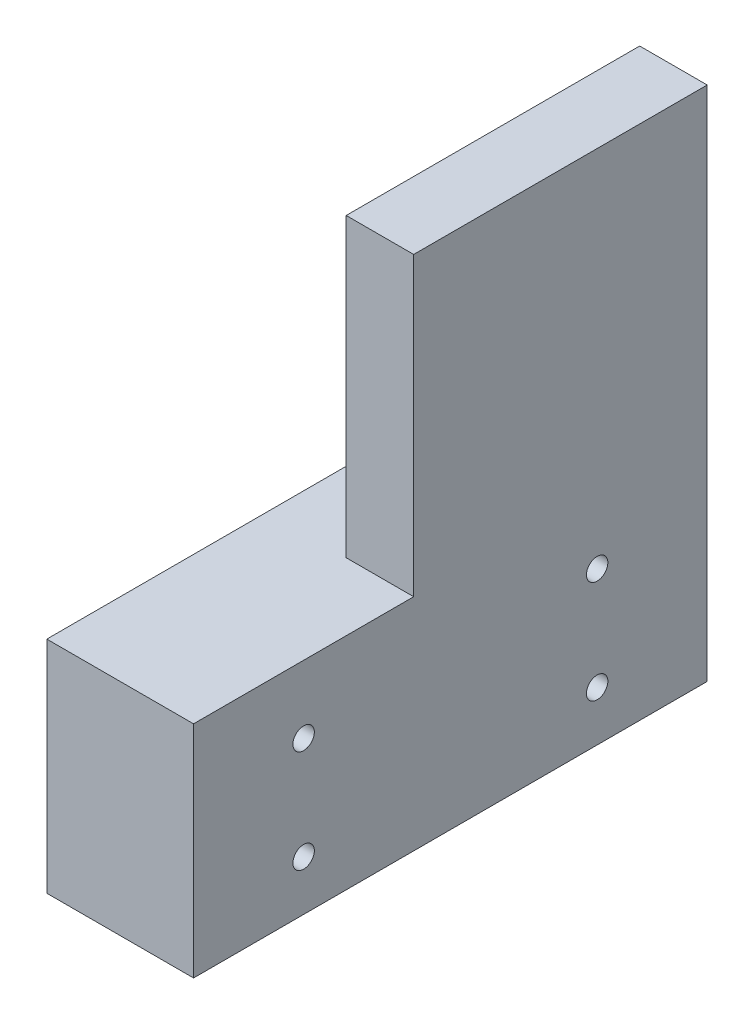
ISO-10303-21;
HEADER;
FILE_DESCRIPTION(('STEP AP214'),'2;1');
FILE_NAME('part.step','',(''),(''),'','','');
FILE_SCHEMA(('AUTOMOTIVE_DESIGN { 1 0 10303 214 1 1 1 1 }'));
ENDSEC;
DATA;
#1=APPLICATION_CONTEXT('core data for automotive mechanical design processes');
#2=APPLICATION_PROTOCOL_DEFINITION('international standard','automotive_design',2000,#1);
#3=PRODUCT_CONTEXT('',#1,'mechanical');
#4=PRODUCT('Part','Part','',(#3));
#5=PRODUCT_RELATED_PRODUCT_CATEGORY('part','',(#4));
#6=PRODUCT_DEFINITION_FORMATION('','',#4);
#7=PRODUCT_DEFINITION_CONTEXT('part definition',#1,'design');
#8=PRODUCT_DEFINITION('design','',#6,#7);
#9=PRODUCT_DEFINITION_SHAPE('','',#8);
#10=(LENGTH_UNIT() NAMED_UNIT(*) SI_UNIT(.MILLI.,.METRE.));
#11=(NAMED_UNIT(*) PLANE_ANGLE_UNIT() SI_UNIT($,.RADIAN.));
#12=(NAMED_UNIT(*) SI_UNIT($,.STERADIAN.) SOLID_ANGLE_UNIT());
#13=UNCERTAINTY_MEASURE_WITH_UNIT(LENGTH_MEASURE(1.E-05),#10,'distance_accuracy_value','');
#14=(GEOMETRIC_REPRESENTATION_CONTEXT(3) GLOBAL_UNCERTAINTY_ASSIGNED_CONTEXT((#13)) GLOBAL_UNIT_ASSIGNED_CONTEXT((#10,
#11,#12)) REPRESENTATION_CONTEXT('',''));
#15=CARTESIAN_POINT('',(0.,0.,0.));
#16=DIRECTION('',(0.,0.,1.));
#17=DIRECTION('',(1.,0.,0.));
#18=AXIS2_PLACEMENT_3D('',#15,#16,#17);
#19=CARTESIAN_POINT('',(12.7,19.05,0.));
#20=DIRECTION('',(0.,-1.,0.));
#21=DIRECTION('',(0.,0.,-1.));
#22=AXIS2_PLACEMENT_3D('',#19,#20,#21);
#23=PLANE('',#22);
#24=DIRECTION('',(1.,0.,0.));
#25=VECTOR('',#24,1.);
#26=CARTESIAN_POINT('',(12.7,19.05,-19.05));
#27=LINE('',#26,#25);
#28=CARTESIAN_POINT('',(6.858,19.05,-19.05));
#29=VERTEX_POINT('',#28);
#30=CARTESIAN_POINT('',(12.7,19.05,-19.05));
#31=VERTEX_POINT('',#30);
#32=EDGE_CURVE('E125',#29,#31,#27,.T.);
#33=ORIENTED_EDGE('',*,*,#32,.F.);
#34=DIRECTION('',(0.,0.,1.));
#35=VECTOR('',#34,1.);
#36=CARTESIAN_POINT('',(6.858,19.05,-44.45));
#37=LINE('',#36,#35);
#38=CARTESIAN_POINT('',(6.858,19.05,-44.45));
#39=VERTEX_POINT('',#38);
#40=EDGE_CURVE('E56',#39,#29,#37,.T.);
#41=ORIENTED_EDGE('',*,*,#40,.F.);
#42=DIRECTION('',(-1.,0.,0.));
#43=VECTOR('',#42,1.);
#44=CARTESIAN_POINT('',(12.7,19.05,-44.45));
#45=LINE('',#44,#43);
#46=CARTESIAN_POINT('',(0.,19.05,-44.45));
#47=VERTEX_POINT('',#46);
#48=EDGE_CURVE('E178',#39,#47,#45,.T.);
#49=ORIENTED_EDGE('',*,*,#48,.T.);
#50=DIRECTION('',(0.,0.,1.));
#51=VECTOR('',#50,1.);
#52=CARTESIAN_POINT('',(0.,19.05,0.));
#53=LINE('',#52,#51);
#54=CARTESIAN_POINT('',(0.,19.05,0.));
#55=VERTEX_POINT('',#54);
#56=EDGE_CURVE('E165',#47,#55,#53,.T.);
#57=ORIENTED_EDGE('',*,*,#56,.T.);
#58=DIRECTION('',(-1.,0.,0.));
#59=VECTOR('',#58,1.);
#60=CARTESIAN_POINT('',(12.7,19.05,0.));
#61=LINE('',#60,#59);
#62=CARTESIAN_POINT('',(12.7,19.05,0.));
#63=VERTEX_POINT('',#62);
#64=EDGE_CURVE('E168',#63,#55,#61,.T.);
#65=ORIENTED_EDGE('',*,*,#64,.F.);
#66=DIRECTION('',(0.,0.,1.));
#67=VECTOR('',#66,1.);
#68=CARTESIAN_POINT('',(12.7,19.05,0.));
#69=LINE('',#68,#67);
#70=EDGE_CURVE('E62',#31,#63,#69,.T.);
#71=ORIENTED_EDGE('',*,*,#70,.F.);
#72=EDGE_LOOP('',(#33,#41,#49,#57,#65,#71));
#73=FACE_BOUND('',#72,.T.);
#74=ADVANCED_FACE('F41',(#73),#23,.F.);
#75=CARTESIAN_POINT('',(12.7,0.,0.));
#76=DIRECTION('',(0.,0.,-1.));
#77=DIRECTION('',(-1.,0.,0.));
#78=AXIS2_PLACEMENT_3D('',#75,#76,#77);
#79=PLANE('',#78);
#80=DIRECTION('',(0.,-1.,0.));
#81=VECTOR('',#80,1.);
#82=CARTESIAN_POINT('',(0.,0.,0.));
#83=LINE('',#82,#81);
#84=CARTESIAN_POINT('',(0.,0.,0.));
#85=VERTEX_POINT('',#84);
#86=EDGE_CURVE('E160',#55,#85,#83,.T.);
#87=ORIENTED_EDGE('',*,*,#86,.T.);
#88=DIRECTION('',(-1.,0.,0.));
#89=VECTOR('',#88,1.);
#90=CARTESIAN_POINT('',(12.7,0.,0.));
#91=LINE('',#90,#89);
#92=CARTESIAN_POINT('',(12.7,0.,0.));
#93=VERTEX_POINT('',#92);
#94=EDGE_CURVE('E11',#93,#85,#91,.T.);
#95=ORIENTED_EDGE('',*,*,#94,.F.);
#96=DIRECTION('',(0.,-1.,0.));
#97=VECTOR('',#96,1.);
#98=CARTESIAN_POINT('',(12.7,0.,0.));
#99=LINE('',#98,#97);
#100=EDGE_CURVE('E163',#63,#93,#99,.T.);
#101=ORIENTED_EDGE('',*,*,#100,.F.);
#102=ORIENTED_EDGE('',*,*,#64,.T.);
#103=EDGE_LOOP('',(#87,#95,#101,#102));
#104=FACE_BOUND('',#103,.T.);
#105=ADVANCED_FACE('F43',(#104),#79,.F.);
#106=CARTESIAN_POINT('',(12.7,0.,0.));
#107=DIRECTION('',(0.,1.,0.));
#108=DIRECTION('',(0.,0.,1.));
#109=AXIS2_PLACEMENT_3D('',#106,#107,#108);
#110=PLANE('',#109);
#111=DIRECTION('',(0.,0.,-1.));
#112=VECTOR('',#111,1.);
#113=CARTESIAN_POINT('',(0.,0.,0.));
#114=LINE('',#113,#112);
#115=CARTESIAN_POINT('',(0.,0.,-44.45));
#116=VERTEX_POINT('',#115);
#117=EDGE_CURVE('E171',#85,#116,#114,.T.);
#118=ORIENTED_EDGE('',*,*,#117,.T.);
#119=DIRECTION('',(-1.,0.,0.));
#120=VECTOR('',#119,1.);
#121=CARTESIAN_POINT('',(12.7,0.,-44.45));
#122=LINE('',#121,#120);
#123=CARTESIAN_POINT('',(12.7,0.,-44.45));
#124=VERTEX_POINT('',#123);
#125=EDGE_CURVE('E49',#124,#116,#122,.T.);
#126=ORIENTED_EDGE('',*,*,#125,.F.);
#127=DIRECTION('',(0.,0.,-1.));
#128=VECTOR('',#127,1.);
#129=CARTESIAN_POINT('',(12.7,0.,0.));
#130=LINE('',#129,#128);
#131=EDGE_CURVE('E106',#93,#124,#130,.T.);
#132=ORIENTED_EDGE('',*,*,#131,.F.);
#133=ORIENTED_EDGE('',*,*,#94,.T.);
#134=EDGE_LOOP('',(#118,#126,#132,#133));
#135=FACE_BOUND('',#134,.T.);
#136=ADVANCED_FACE('F210',(#135),#110,.F.);
#137=CARTESIAN_POINT('',(12.7,0.,-44.45));
#138=DIRECTION('',(0.,0.,1.));
#139=DIRECTION('',(1.,0.,0.));
#140=AXIS2_PLACEMENT_3D('',#137,#138,#139);
#141=PLANE('',#140);
#142=DIRECTION('',(0.,1.,0.));
#143=VECTOR('',#142,1.);
#144=CARTESIAN_POINT('',(0.,0.,-44.45));
#145=LINE('',#144,#143);
#146=EDGE_CURVE('E173',#116,#47,#145,.T.);
#147=ORIENTED_EDGE('',*,*,#146,.T.);
#148=ORIENTED_EDGE('',*,*,#48,.F.);
#149=DIRECTION('',(0.,-1.,0.));
#150=VECTOR('',#149,1.);
#151=CARTESIAN_POINT('',(6.858,44.704,-44.45));
#152=LINE('',#151,#150);
#153=CARTESIAN_POINT('',(6.858,44.704,-44.45));
#154=VERTEX_POINT('',#153);
#155=EDGE_CURVE('E116',#154,#39,#152,.T.);
#156=ORIENTED_EDGE('',*,*,#155,.F.);
#157=DIRECTION('',(-1.,0.,0.));
#158=VECTOR('',#157,1.);
#159=CARTESIAN_POINT('',(12.7,44.704,-44.45));
#160=LINE('',#159,#158);
#161=CARTESIAN_POINT('',(12.7,44.704,-44.45));
#162=VERTEX_POINT('',#161);
#163=EDGE_CURVE('E112',#162,#154,#160,.T.);
#164=ORIENTED_EDGE('',*,*,#163,.F.);
#165=DIRECTION('',(0.,1.,0.));
#166=VECTOR('',#165,1.);
#167=CARTESIAN_POINT('',(12.7,0.,-44.45));
#168=LINE('',#167,#166);
#169=EDGE_CURVE('E99',#124,#162,#168,.T.);
#170=ORIENTED_EDGE('',*,*,#169,.F.);
#171=ORIENTED_EDGE('',*,*,#125,.T.);
#172=EDGE_LOOP('',(#147,#148,#156,#164,#170,#171));
#173=FACE_BOUND('',#172,.T.);
#174=ADVANCED_FACE('F114',(#173),#141,.F.);
#175=CARTESIAN_POINT('',(12.7,0.,0.));
#176=DIRECTION('',(-1.,0.,0.));
#177=DIRECTION('',(0.,0.,1.));
#178=AXIS2_PLACEMENT_3D('',#175,#176,#177);
#179=PLANE('',#178);
#180=CARTESIAN_POINT('',(12.7,13.208,-9.525));
#181=DIRECTION('',(1.,0.,0.));
#182=DIRECTION('',(0.,0.,-1.));
#183=AXIS2_PLACEMENT_3D('',#180,#181,#182);
#184=CIRCLE('',#183,0.927000050999996);
#185=CARTESIAN_POINT('',(12.7,13.208,-10.452000051));
#186=VERTEX_POINT('',#185);
#187=EDGE_CURVE('E138',#186,#186,#184,.T.);
#188=ORIENTED_EDGE('',*,*,#187,.F.);
#189=EDGE_LOOP('',(#188));
#190=FACE_BOUND('',#189,.T.);
#191=CARTESIAN_POINT('',(12.7,13.208,-34.925));
#192=DIRECTION('',(1.,0.,0.));
#193=DIRECTION('',(0.,0.,-1.));
#194=AXIS2_PLACEMENT_3D('',#191,#192,#193);
#195=CIRCLE('',#194,0.927000051000003);
#196=CARTESIAN_POINT('',(12.7,13.208,-35.852000051));
#197=VERTEX_POINT('',#196);
#198=EDGE_CURVE('E149',#197,#197,#195,.T.);
#199=ORIENTED_EDGE('',*,*,#198,.F.);
#200=EDGE_LOOP('',(#199));
#201=FACE_BOUND('',#200,.T.);
#202=CARTESIAN_POINT('',(12.7,4.318,-34.925));
#203=DIRECTION('',(1.,0.,0.));
#204=DIRECTION('',(0.,0.,-1.));
#205=AXIS2_PLACEMENT_3D('',#202,#203,#204);
#206=CIRCLE('',#205,0.927000050999995);
#207=CARTESIAN_POINT('',(12.7,4.318,-35.852000051));
#208=VERTEX_POINT('',#207);
#209=EDGE_CURVE('E143',#208,#208,#206,.T.);
#210=ORIENTED_EDGE('',*,*,#209,.F.);
#211=EDGE_LOOP('',(#210));
#212=FACE_BOUND('',#211,.T.);
#213=CARTESIAN_POINT('',(12.7,4.318,-9.52500000000003));
#214=DIRECTION('',(1.,0.,0.));
#215=DIRECTION('',(0.,0.,-1.));
#216=AXIS2_PLACEMENT_3D('',#213,#214,#215);
#217=CIRCLE('',#216,0.927000050999999);
#218=CARTESIAN_POINT('',(12.7,4.318,-10.452000051));
#219=VERTEX_POINT('',#218);
#220=EDGE_CURVE('E157',#219,#219,#217,.T.);
#221=ORIENTED_EDGE('',*,*,#220,.F.);
#222=EDGE_LOOP('',(#221));
#223=FACE_BOUND('',#222,.T.);
#224=ORIENTED_EDGE('',*,*,#100,.T.);
#225=ORIENTED_EDGE('',*,*,#131,.T.);
#226=ORIENTED_EDGE('',*,*,#169,.T.);
#227=DIRECTION('',(0.,0.,-1.));
#228=VECTOR('',#227,1.);
#229=CARTESIAN_POINT('',(12.7,44.704,-44.45));
#230=LINE('',#229,#228);
#231=CARTESIAN_POINT('',(12.7,44.704,-19.05));
#232=VERTEX_POINT('',#231);
#233=EDGE_CURVE('E105',#232,#162,#230,.T.);
#234=ORIENTED_EDGE('',*,*,#233,.F.);
#235=DIRECTION('',(0.,-1.,0.));
#236=VECTOR('',#235,1.);
#237=CARTESIAN_POINT('',(12.7,44.704,-19.05));
#238=LINE('',#237,#236);
#239=EDGE_CURVE('E131',#232,#31,#238,.T.);
#240=ORIENTED_EDGE('',*,*,#239,.T.);
#241=ORIENTED_EDGE('',*,*,#70,.T.);
#242=EDGE_LOOP('',(#224,#225,#226,#234,#240,#241));
#243=FACE_BOUND('',#242,.T.);
#244=ADVANCED_FACE('F102',(#190,#201,#212,#223,#243),#179,.F.);
#245=CARTESIAN_POINT('',(0.,0.,0.));
#246=DIRECTION('',(-1.,0.,0.));
#247=DIRECTION('',(0.,0.,1.));
#248=AXIS2_PLACEMENT_3D('',#245,#246,#247);
#249=PLANE('',#248);
#250=CARTESIAN_POINT('',(0.,13.208,-9.525));
#251=DIRECTION('',(1.,0.,0.));
#252=DIRECTION('',(0.,0.,-1.));
#253=AXIS2_PLACEMENT_3D('',#250,#251,#252);
#254=CIRCLE('',#253,0.927000050999996);
#255=CARTESIAN_POINT('',(0.,13.208,-10.452000051));
#256=VERTEX_POINT('',#255);
#257=EDGE_CURVE('E152',#256,#256,#254,.T.);
#258=ORIENTED_EDGE('',*,*,#257,.T.);
#259=EDGE_LOOP('',(#258));
#260=FACE_BOUND('',#259,.T.);
#261=CARTESIAN_POINT('',(0.,13.208,-34.925));
#262=DIRECTION('',(1.,0.,0.));
#263=DIRECTION('',(0.,0.,-1.));
#264=AXIS2_PLACEMENT_3D('',#261,#262,#263);
#265=CIRCLE('',#264,0.927000051000003);
#266=CARTESIAN_POINT('',(0.,13.208,-35.852000051));
#267=VERTEX_POINT('',#266);
#268=EDGE_CURVE('E146',#267,#267,#265,.T.);
#269=ORIENTED_EDGE('',*,*,#268,.T.);
#270=EDGE_LOOP('',(#269));
#271=FACE_BOUND('',#270,.T.);
#272=CARTESIAN_POINT('',(0.,4.318,-34.925));
#273=DIRECTION('',(1.,0.,0.));
#274=DIRECTION('',(0.,0.,-1.));
#275=AXIS2_PLACEMENT_3D('',#272,#273,#274);
#276=CIRCLE('',#275,0.927000050999995);
#277=CARTESIAN_POINT('',(0.,4.318,-35.852000051));
#278=VERTEX_POINT('',#277);
#279=EDGE_CURVE('E139',#278,#278,#276,.T.);
#280=ORIENTED_EDGE('',*,*,#279,.T.);
#281=EDGE_LOOP('',(#280));
#282=FACE_BOUND('',#281,.T.);
#283=CARTESIAN_POINT('',(0.,4.318,-9.52500000000003));
#284=DIRECTION('',(1.,0.,0.));
#285=DIRECTION('',(0.,0.,-1.));
#286=AXIS2_PLACEMENT_3D('',#283,#284,#285);
#287=CIRCLE('',#286,0.927000050999999);
#288=CARTESIAN_POINT('',(0.,4.318,-10.452000051));
#289=VERTEX_POINT('',#288);
#290=EDGE_CURVE('E142',#289,#289,#287,.T.);
#291=ORIENTED_EDGE('',*,*,#290,.T.);
#292=EDGE_LOOP('',(#291));
#293=FACE_BOUND('',#292,.T.);
#294=ORIENTED_EDGE('',*,*,#86,.F.);
#295=ORIENTED_EDGE('',*,*,#56,.F.);
#296=ORIENTED_EDGE('',*,*,#146,.F.);
#297=ORIENTED_EDGE('',*,*,#117,.F.);
#298=EDGE_LOOP('',(#294,#295,#296,#297));
#299=FACE_BOUND('',#298,.T.);
#300=ADVANCED_FACE('F184',(#260,#271,#282,#293,#299),#249,.T.);
#301=CARTESIAN_POINT('',(12.7,4.318,-9.52500000000003));
#302=DIRECTION('',(-1.,0.,0.));
#303=DIRECTION('',(0.,0.,1.));
#304=AXIS2_PLACEMENT_3D('',#301,#302,#303);
#305=CYLINDRICAL_SURFACE('',#304,0.927000050999999);
#306=ORIENTED_EDGE('',*,*,#220,.T.);
#307=EDGE_LOOP('',(#306));
#308=FACE_BOUND('',#307,.T.);
#309=ORIENTED_EDGE('',*,*,#290,.F.);
#310=EDGE_LOOP('',(#309));
#311=FACE_BOUND('',#310,.T.);
#312=ADVANCED_FACE('F236',(#308,#311),#305,.F.);
#313=CARTESIAN_POINT('',(12.7,4.318,-34.925));
#314=DIRECTION('',(-1.,0.,0.));
#315=DIRECTION('',(0.,0.,1.));
#316=AXIS2_PLACEMENT_3D('',#313,#314,#315);
#317=CYLINDRICAL_SURFACE('',#316,0.927000050999995);
#318=ORIENTED_EDGE('',*,*,#209,.T.);
#319=EDGE_LOOP('',(#318));
#320=FACE_BOUND('',#319,.T.);
#321=ORIENTED_EDGE('',*,*,#279,.F.);
#322=EDGE_LOOP('',(#321));
#323=FACE_BOUND('',#322,.T.);
#324=ADVANCED_FACE('F243',(#320,#323),#317,.F.);
#325=CARTESIAN_POINT('',(12.7,13.208,-34.925));
#326=DIRECTION('',(-1.,0.,0.));
#327=DIRECTION('',(0.,0.,1.));
#328=AXIS2_PLACEMENT_3D('',#325,#326,#327);
#329=CYLINDRICAL_SURFACE('',#328,0.927000051000003);
#330=ORIENTED_EDGE('',*,*,#198,.T.);
#331=EDGE_LOOP('',(#330));
#332=FACE_BOUND('',#331,.T.);
#333=ORIENTED_EDGE('',*,*,#268,.F.);
#334=EDGE_LOOP('',(#333));
#335=FACE_BOUND('',#334,.T.);
#336=ADVANCED_FACE('F201',(#332,#335),#329,.F.);
#337=CARTESIAN_POINT('',(12.7,13.208,-9.525));
#338=DIRECTION('',(-1.,0.,0.));
#339=DIRECTION('',(0.,0.,1.));
#340=AXIS2_PLACEMENT_3D('',#337,#338,#339);
#341=CYLINDRICAL_SURFACE('',#340,0.927000050999996);
#342=ORIENTED_EDGE('',*,*,#187,.T.);
#343=EDGE_LOOP('',(#342));
#344=FACE_BOUND('',#343,.T.);
#345=ORIENTED_EDGE('',*,*,#257,.F.);
#346=EDGE_LOOP('',(#345));
#347=FACE_BOUND('',#346,.T.);
#348=ADVANCED_FACE('F194',(#344,#347),#341,.F.);
#349=CARTESIAN_POINT('',(6.858,44.704,-44.45));
#350=DIRECTION('',(1.,0.,0.));
#351=DIRECTION('',(0.,0.,-1.));
#352=AXIS2_PLACEMENT_3D('',#349,#350,#351);
#353=PLANE('',#352);
#354=ORIENTED_EDGE('',*,*,#40,.T.);
#355=DIRECTION('',(0.,-1.,0.));
#356=VECTOR('',#355,1.);
#357=CARTESIAN_POINT('',(6.858,44.704,-19.05));
#358=LINE('',#357,#356);
#359=CARTESIAN_POINT('',(6.858,44.704,-19.05));
#360=VERTEX_POINT('',#359);
#361=EDGE_CURVE('E134',#360,#29,#358,.T.);
#362=ORIENTED_EDGE('',*,*,#361,.F.);
#363=DIRECTION('',(0.,0.,1.));
#364=VECTOR('',#363,1.);
#365=CARTESIAN_POINT('',(6.858,44.704,-44.45));
#366=LINE('',#365,#364);
#367=EDGE_CURVE('E119',#154,#360,#366,.T.);
#368=ORIENTED_EDGE('',*,*,#367,.F.);
#369=ORIENTED_EDGE('',*,*,#155,.T.);
#370=EDGE_LOOP('',(#354,#362,#368,#369));
#371=FACE_BOUND('',#370,.T.);
#372=ADVANCED_FACE('F192',(#371),#353,.F.);
#373=CARTESIAN_POINT('',(12.7,44.704,-19.05));
#374=DIRECTION('',(0.,0.,-1.));
#375=DIRECTION('',(-1.,0.,0.));
#376=AXIS2_PLACEMENT_3D('',#373,#374,#375);
#377=PLANE('',#376);
#378=ORIENTED_EDGE('',*,*,#32,.T.);
#379=ORIENTED_EDGE('',*,*,#239,.F.);
#380=DIRECTION('',(1.,0.,0.));
#381=VECTOR('',#380,1.);
#382=CARTESIAN_POINT('',(12.7,44.704,-19.05));
#383=LINE('',#382,#381);
#384=EDGE_CURVE('E123',#360,#232,#383,.T.);
#385=ORIENTED_EDGE('',*,*,#384,.F.);
#386=ORIENTED_EDGE('',*,*,#361,.T.);
#387=EDGE_LOOP('',(#378,#379,#385,#386));
#388=FACE_BOUND('',#387,.T.);
#389=ADVANCED_FACE('F189',(#388),#377,.F.);
#390=CARTESIAN_POINT('',(0.,44.704,0.));
#391=DIRECTION('',(0.,-1.,0.));
#392=DIRECTION('',(0.,0.,-1.));
#393=AXIS2_PLACEMENT_3D('',#390,#391,#392);
#394=PLANE('',#393);
#395=ORIENTED_EDGE('',*,*,#233,.T.);
#396=ORIENTED_EDGE('',*,*,#163,.T.);
#397=ORIENTED_EDGE('',*,*,#367,.T.);
#398=ORIENTED_EDGE('',*,*,#384,.T.);
#399=EDGE_LOOP('',(#395,#396,#397,#398));
#400=FACE_BOUND('',#399,.T.);
#401=ADVANCED_FACE('F121',(#400),#394,.F.);
#402=CLOSED_SHELL('',(#74,#105,#136,#174,#244,#300,#312,#324,#336,#348,#372,#389,#401));
#403=MANIFOLD_SOLID_BREP('B2',#402);
#404=ADVANCED_BREP_SHAPE_REPRESENTATION('',(#18,#403),#14);
#405=SHAPE_DEFINITION_REPRESENTATION(#9,#404);
ENDSEC;
END-ISO-10303-21;
